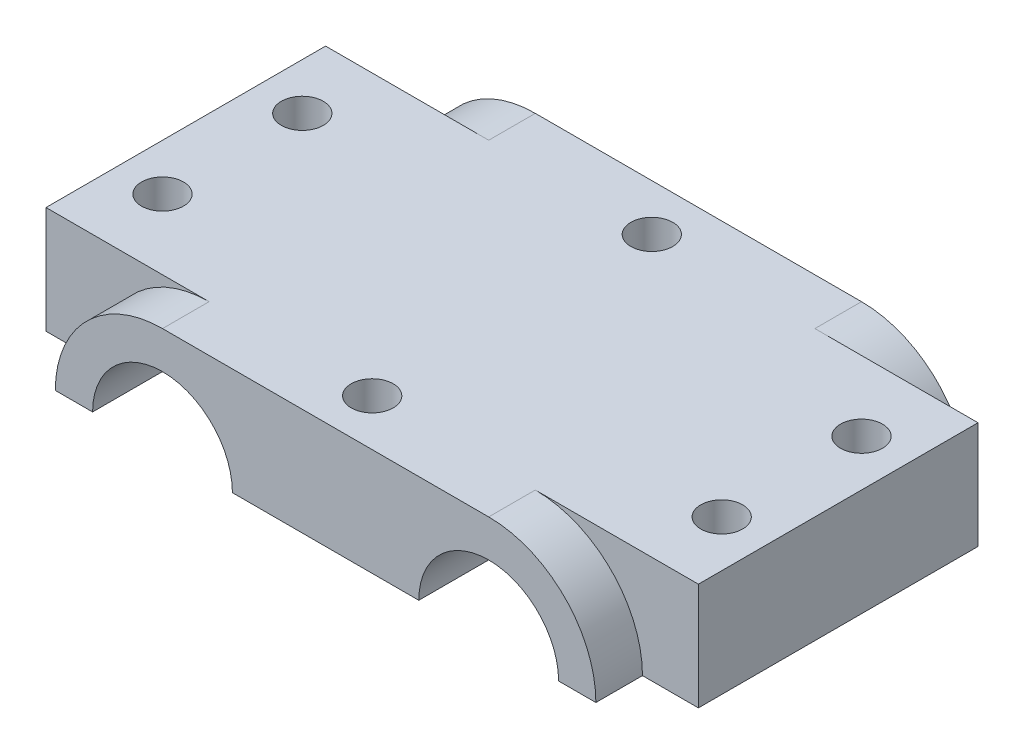
ISO-10303-21;
HEADER;
FILE_DESCRIPTION(('STEP AP214'),'2;1');
FILE_NAME('part.step','',(''),(''),'','','');
FILE_SCHEMA(('AUTOMOTIVE_DESIGN { 1 0 10303 214 1 1 1 1 }'));
ENDSEC;
DATA;
#1=APPLICATION_CONTEXT('core data for automotive mechanical design processes');
#2=APPLICATION_PROTOCOL_DEFINITION('international standard','automotive_design',2000,#1);
#3=PRODUCT_CONTEXT('',#1,'mechanical');
#4=PRODUCT('Part','Part','',(#3));
#5=PRODUCT_RELATED_PRODUCT_CATEGORY('part','',(#4));
#6=PRODUCT_DEFINITION_FORMATION('','',#4);
#7=PRODUCT_DEFINITION_CONTEXT('part definition',#1,'design');
#8=PRODUCT_DEFINITION('design','',#6,#7);
#9=PRODUCT_DEFINITION_SHAPE('','',#8);
#10=(LENGTH_UNIT() NAMED_UNIT(*) SI_UNIT(.MILLI.,.METRE.));
#11=(NAMED_UNIT(*) PLANE_ANGLE_UNIT() SI_UNIT($,.RADIAN.));
#12=(NAMED_UNIT(*) SI_UNIT($,.STERADIAN.) SOLID_ANGLE_UNIT());
#13=UNCERTAINTY_MEASURE_WITH_UNIT(LENGTH_MEASURE(1.E-05),#10,'distance_accuracy_value','');
#14=(GEOMETRIC_REPRESENTATION_CONTEXT(3) GLOBAL_UNCERTAINTY_ASSIGNED_CONTEXT((#13)) GLOBAL_UNIT_ASSIGNED_CONTEXT((#10,
#11,#12)) REPRESENTATION_CONTEXT('',''));
#15=CARTESIAN_POINT('',(0.,0.,0.));
#16=DIRECTION('',(0.,0.,1.));
#17=DIRECTION('',(1.,0.,0.));
#18=AXIS2_PLACEMENT_3D('',#15,#16,#17);
#19=CARTESIAN_POINT('',(35.,5.75000000000001,20.));
#20=DIRECTION('',(-1.,0.,0.));
#21=DIRECTION('',(0.,-1.,0.));
#22=AXIS2_PLACEMENT_3D('',#19,#20,#21);
#23=PLANE('',#22);
#24=DIRECTION('',(0.,1.,0.));
#25=VECTOR('',#24,1.);
#26=CARTESIAN_POINT('',(35.,-5.75,-15.));
#27=LINE('',#26,#25);
#28=CARTESIAN_POINT('',(35.,-5.75,-15.));
#29=VERTEX_POINT('',#28);
#30=CARTESIAN_POINT('',(35.,5.75000000000001,-15.));
#31=VERTEX_POINT('',#30);
#32=EDGE_CURVE('E173',#29,#31,#27,.T.);
#33=ORIENTED_EDGE('',*,*,#32,.T.);
#34=DIRECTION('',(0.,0.,-1.));
#35=VECTOR('',#34,1.);
#36=CARTESIAN_POINT('',(35.,5.75000000000001,20.));
#37=LINE('',#36,#35);
#38=CARTESIAN_POINT('',(35.,5.75000000000001,15.));
#39=VERTEX_POINT('',#38);
#40=EDGE_CURVE('E172',#39,#31,#37,.T.);
#41=ORIENTED_EDGE('',*,*,#40,.F.);
#42=DIRECTION('',(0.,1.,0.));
#43=VECTOR('',#42,1.);
#44=CARTESIAN_POINT('',(35.,-5.75,15.));
#45=LINE('',#44,#43);
#46=CARTESIAN_POINT('',(35.,-5.75,15.));
#47=VERTEX_POINT('',#46);
#48=EDGE_CURVE('E206',#47,#39,#45,.T.);
#49=ORIENTED_EDGE('',*,*,#48,.F.);
#50=DIRECTION('',(0.,0.,-1.));
#51=VECTOR('',#50,1.);
#52=CARTESIAN_POINT('',(35.,-5.75,20.));
#53=LINE('',#52,#51);
#54=EDGE_CURVE('E47',#47,#29,#53,.T.);
#55=ORIENTED_EDGE('',*,*,#54,.T.);
#56=EDGE_LOOP('',(#33,#41,#49,#55));
#57=FACE_BOUND('',#56,.T.);
#58=ADVANCED_FACE('F39',(#57),#23,.F.);
#59=CARTESIAN_POINT('',(35.,5.75000000000001,20.));
#60=DIRECTION('',(0.,-1.,0.));
#61=DIRECTION('',(1.,0.,0.));
#62=AXIS2_PLACEMENT_3D('',#59,#60,#61);
#63=PLANE('',#62);
#64=CARTESIAN_POINT('',(0.,5.75,-15.));
#65=DIRECTION('',(0.,1.,0.));
#66=DIRECTION('',(0.,0.,1.));
#67=AXIS2_PLACEMENT_3D('',#64,#65,#66);
#68=CIRCLE('',#67,2.25000000000001);
#69=CARTESIAN_POINT('',(0.,5.75,-12.75));
#70=VERTEX_POINT('',#69);
#71=EDGE_CURVE('E542',#70,#70,#68,.T.);
#72=ORIENTED_EDGE('',*,*,#71,.F.);
#73=EDGE_LOOP('',(#72));
#74=FACE_BOUND('',#73,.T.);
#75=CARTESIAN_POINT('',(0.,5.75,15.));
#76=DIRECTION('',(0.,1.,0.));
#77=DIRECTION('',(0.,0.,1.));
#78=AXIS2_PLACEMENT_3D('',#75,#76,#77);
#79=CIRCLE('',#78,2.25000000000001);
#80=CARTESIAN_POINT('',(0.,5.75,17.25));
#81=VERTEX_POINT('',#80);
#82=EDGE_CURVE('E358',#81,#81,#79,.T.);
#83=ORIENTED_EDGE('',*,*,#82,.F.);
#84=EDGE_LOOP('',(#83));
#85=FACE_BOUND('',#84,.T.);
#86=CARTESIAN_POINT('',(-30.,5.75000000000001,-7.5));
#87=DIRECTION('',(0.,1.,0.));
#88=DIRECTION('',(0.,0.,1.));
#89=AXIS2_PLACEMENT_3D('',#86,#87,#88);
#90=CIRCLE('',#89,2.25000000000001);
#91=CARTESIAN_POINT('',(-30.,5.75000000000001,-5.24999999999999));
#92=VERTEX_POINT('',#91);
#93=EDGE_CURVE('E357',#92,#92,#90,.T.);
#94=ORIENTED_EDGE('',*,*,#93,.F.);
#95=EDGE_LOOP('',(#94));
#96=FACE_BOUND('',#95,.T.);
#97=CARTESIAN_POINT('',(-30.,5.75000000000001,7.5));
#98=DIRECTION('',(0.,1.,0.));
#99=DIRECTION('',(0.,0.,1.));
#100=AXIS2_PLACEMENT_3D('',#97,#98,#99);
#101=CIRCLE('',#100,2.25000000000001);
#102=CARTESIAN_POINT('',(-30.,5.75000000000001,9.75000000000001));
#103=VERTEX_POINT('',#102);
#104=EDGE_CURVE('E368',#103,#103,#101,.T.);
#105=ORIENTED_EDGE('',*,*,#104,.F.);
#106=EDGE_LOOP('',(#105));
#107=FACE_BOUND('',#106,.T.);
#108=CARTESIAN_POINT('',(30.,5.75000000000001,-7.5));
#109=DIRECTION('',(0.,1.,0.));
#110=DIRECTION('',(0.,0.,1.));
#111=AXIS2_PLACEMENT_3D('',#108,#109,#110);
#112=CIRCLE('',#111,2.25000000000002);
#113=CARTESIAN_POINT('',(30.,5.75000000000001,-5.24999999999998));
#114=VERTEX_POINT('',#113);
#115=EDGE_CURVE('E374',#114,#114,#112,.T.);
#116=ORIENTED_EDGE('',*,*,#115,.F.);
#117=EDGE_LOOP('',(#116));
#118=FACE_BOUND('',#117,.T.);
#119=CARTESIAN_POINT('',(30.,5.75000000000001,7.5));
#120=DIRECTION('',(0.,1.,0.));
#121=DIRECTION('',(0.,0.,1.));
#122=AXIS2_PLACEMENT_3D('',#119,#120,#121);
#123=CIRCLE('',#122,2.25000000000002);
#124=CARTESIAN_POINT('',(30.,5.75000000000001,9.75000000000002));
#125=VERTEX_POINT('',#124);
#126=EDGE_CURVE('E380',#125,#125,#123,.T.);
#127=ORIENTED_EDGE('',*,*,#126,.F.);
#128=EDGE_LOOP('',(#127));
#129=FACE_BOUND('',#128,.T.);
#130=DIRECTION('',(-1.,0.,0.));
#131=VECTOR('',#130,1.);
#132=CARTESIAN_POINT('',(35.,5.75000000000001,-15.));
#133=LINE('',#132,#131);
#134=CARTESIAN_POINT('',(17.5,5.75000000000001,-15.));
#135=VERTEX_POINT('',#134);
#136=EDGE_CURVE('E164',#31,#135,#133,.T.);
#137=ORIENTED_EDGE('',*,*,#136,.T.);
#138=DIRECTION('',(0.,0.,-1.));
#139=VECTOR('',#138,1.);
#140=CARTESIAN_POINT('',(17.5,5.75000000000001,-15.));
#141=LINE('',#140,#139);
#142=CARTESIAN_POINT('',(17.5,5.75000000000001,-20.));
#143=VERTEX_POINT('',#142);
#144=EDGE_CURVE('E151',#135,#143,#141,.T.);
#145=ORIENTED_EDGE('',*,*,#144,.T.);
#146=DIRECTION('',(-1.,0.,0.));
#147=VECTOR('',#146,1.);
#148=CARTESIAN_POINT('',(35.,5.75000000000001,-20.));
#149=LINE('',#148,#147);
#150=CARTESIAN_POINT('',(-17.5,5.75,-20.));
#151=VERTEX_POINT('',#150);
#152=EDGE_CURVE('E264',#143,#151,#149,.T.);
#153=ORIENTED_EDGE('',*,*,#152,.T.);
#154=DIRECTION('',(0.,0.,-1.));
#155=VECTOR('',#154,1.);
#156=CARTESIAN_POINT('',(-17.5,5.75000000000001,-15.));
#157=LINE('',#156,#155);
#158=CARTESIAN_POINT('',(-17.5,5.75000000000001,-15.));
#159=VERTEX_POINT('',#158);
#160=EDGE_CURVE('E62',#159,#151,#157,.T.);
#161=ORIENTED_EDGE('',*,*,#160,.F.);
#162=DIRECTION('',(-1.,0.,0.));
#163=VECTOR('',#162,1.);
#164=CARTESIAN_POINT('',(-17.5,5.75000000000001,-15.));
#165=LINE('',#164,#163);
#166=CARTESIAN_POINT('',(-35.,5.75,-15.));
#167=VERTEX_POINT('',#166);
#168=EDGE_CURVE('E183',#159,#167,#165,.T.);
#169=ORIENTED_EDGE('',*,*,#168,.T.);
#170=DIRECTION('',(0.,0.,-1.));
#171=VECTOR('',#170,1.);
#172=CARTESIAN_POINT('',(-35.,5.75,20.));
#173=LINE('',#172,#171);
#174=CARTESIAN_POINT('',(-35.,5.75,15.));
#175=VERTEX_POINT('',#174);
#176=EDGE_CURVE('E261',#175,#167,#173,.T.);
#177=ORIENTED_EDGE('',*,*,#176,.F.);
#178=DIRECTION('',(-1.,0.,0.));
#179=VECTOR('',#178,1.);
#180=CARTESIAN_POINT('',(-17.5,5.75000000000001,15.));
#181=LINE('',#180,#179);
#182=CARTESIAN_POINT('',(-17.5,5.75000000000001,15.));
#183=VERTEX_POINT('',#182);
#184=EDGE_CURVE('E225',#183,#175,#181,.T.);
#185=ORIENTED_EDGE('',*,*,#184,.F.);
#186=DIRECTION('',(0.,0.,1.));
#187=VECTOR('',#186,1.);
#188=CARTESIAN_POINT('',(-17.5,5.75000000000001,15.));
#189=LINE('',#188,#187);
#190=CARTESIAN_POINT('',(-17.5,5.75000000000001,20.));
#191=VERTEX_POINT('',#190);
#192=EDGE_CURVE('E181',#183,#191,#189,.T.);
#193=ORIENTED_EDGE('',*,*,#192,.T.);
#194=DIRECTION('',(-1.,0.,0.));
#195=VECTOR('',#194,1.);
#196=CARTESIAN_POINT('',(35.,5.75000000000001,20.));
#197=LINE('',#196,#195);
#198=CARTESIAN_POINT('',(17.5,5.75,20.));
#199=VERTEX_POINT('',#198);
#200=EDGE_CURVE('E256',#199,#191,#197,.T.);
#201=ORIENTED_EDGE('',*,*,#200,.F.);
#202=DIRECTION('',(0.,0.,1.));
#203=VECTOR('',#202,1.);
#204=CARTESIAN_POINT('',(17.5,5.75000000000001,15.));
#205=LINE('',#204,#203);
#206=CARTESIAN_POINT('',(17.5,5.75000000000001,15.));
#207=VERTEX_POINT('',#206);
#208=EDGE_CURVE('E214',#207,#199,#205,.T.);
#209=ORIENTED_EDGE('',*,*,#208,.F.);
#210=DIRECTION('',(-1.,0.,0.));
#211=VECTOR('',#210,1.);
#212=CARTESIAN_POINT('',(35.,5.75000000000001,15.));
#213=LINE('',#212,#211);
#214=EDGE_CURVE('E208',#39,#207,#213,.T.);
#215=ORIENTED_EDGE('',*,*,#214,.F.);
#216=ORIENTED_EDGE('',*,*,#40,.T.);
#217=EDGE_LOOP('',(#137,#145,#153,#161,#169,#177,#185,#193,#201,#209,#215,#216));
#218=FACE_BOUND('',#217,.T.);
#219=ADVANCED_FACE('F169',(#74,#85,#96,#107,#118,#129,#218),#63,.F.);
#220=CARTESIAN_POINT('',(35.,-5.75,20.));
#221=DIRECTION('',(0.,1.,0.));
#222=DIRECTION('',(-1.,0.,0.));
#223=AXIS2_PLACEMENT_3D('',#220,#221,#222);
#224=PLANE('',#223);
#225=CARTESIAN_POINT('',(-30.,-5.75000000000001,-7.5));
#226=DIRECTION('',(0.,1.,0.));
#227=DIRECTION('',(0.,0.,1.));
#228=AXIS2_PLACEMENT_3D('',#225,#226,#227);
#229=CIRCLE('',#228,2.25000000000001);
#230=CARTESIAN_POINT('',(-30.,-5.75000000000001,-5.24999999999999));
#231=VERTEX_POINT('',#230);
#232=EDGE_CURVE('E361',#231,#231,#229,.T.);
#233=ORIENTED_EDGE('',*,*,#232,.T.);
#234=EDGE_LOOP('',(#233));
#235=FACE_BOUND('',#234,.T.);
#236=CARTESIAN_POINT('',(-30.,-5.75000000000001,7.5));
#237=DIRECTION('',(0.,1.,0.));
#238=DIRECTION('',(0.,0.,1.));
#239=AXIS2_PLACEMENT_3D('',#236,#237,#238);
#240=CIRCLE('',#239,2.25000000000001);
#241=CARTESIAN_POINT('',(-30.,-5.75000000000001,9.75000000000001));
#242=VERTEX_POINT('',#241);
#243=EDGE_CURVE('E371',#242,#242,#240,.T.);
#244=ORIENTED_EDGE('',*,*,#243,.T.);
#245=EDGE_LOOP('',(#244));
#246=FACE_BOUND('',#245,.T.);
#247=DIRECTION('',(0.,0.,-1.));
#248=VECTOR('',#247,1.);
#249=CARTESIAN_POINT('',(-29.,-5.75,-15.));
#250=LINE('',#249,#248);
#251=CARTESIAN_POINT('',(-29.,-5.75,-15.));
#252=VERTEX_POINT('',#251);
#253=CARTESIAN_POINT('',(-29.,-5.75,-20.));
#254=VERTEX_POINT('',#253);
#255=EDGE_CURVE('E180',#252,#254,#250,.T.);
#256=ORIENTED_EDGE('',*,*,#255,.T.);
#257=DIRECTION('',(1.,0.,0.));
#258=VECTOR('',#257,1.);
#259=CARTESIAN_POINT('',(35.,-5.75,-20.));
#260=LINE('',#259,#258);
#261=CARTESIAN_POINT('',(-25.,-5.75,-20.));
#262=VERTEX_POINT('',#261);
#263=EDGE_CURVE('E262',#254,#262,#260,.T.);
#264=ORIENTED_EDGE('',*,*,#263,.T.);
#265=DIRECTION('',(0.,0.,1.));
#266=VECTOR('',#265,1.);
#267=CARTESIAN_POINT('',(-25.,-5.75000000000001,-20.001));
#268=LINE('',#267,#266);
#269=CARTESIAN_POINT('',(-25.,-5.75000000000001,20.));
#270=VERTEX_POINT('',#269);
#271=EDGE_CURVE('E245',#262,#270,#268,.T.);
#272=ORIENTED_EDGE('',*,*,#271,.T.);
#273=DIRECTION('',(1.,0.,0.));
#274=VECTOR('',#273,1.);
#275=CARTESIAN_POINT('',(35.,-5.75,20.));
#276=LINE('',#275,#274);
#277=CARTESIAN_POINT('',(-29.,-5.75,20.));
#278=VERTEX_POINT('',#277);
#279=EDGE_CURVE('E254',#278,#270,#276,.T.);
#280=ORIENTED_EDGE('',*,*,#279,.F.);
#281=DIRECTION('',(0.,0.,1.));
#282=VECTOR('',#281,1.);
#283=CARTESIAN_POINT('',(-29.,-5.75,15.));
#284=LINE('',#283,#282);
#285=CARTESIAN_POINT('',(-29.,-5.75,15.));
#286=VERTEX_POINT('',#285);
#287=EDGE_CURVE('E219',#286,#278,#284,.T.);
#288=ORIENTED_EDGE('',*,*,#287,.F.);
#289=DIRECTION('',(1.,0.,0.));
#290=VECTOR('',#289,1.);
#291=CARTESIAN_POINT('',(-35.,-5.75000000000001,15.));
#292=LINE('',#291,#290);
#293=CARTESIAN_POINT('',(-35.,-5.75000000000001,15.));
#294=VERTEX_POINT('',#293);
#295=EDGE_CURVE('E228',#294,#286,#292,.T.);
#296=ORIENTED_EDGE('',*,*,#295,.F.);
#297=DIRECTION('',(0.,0.,-1.));
#298=VECTOR('',#297,1.);
#299=CARTESIAN_POINT('',(-35.,-5.75000000000001,20.));
#300=LINE('',#299,#298);
#301=CARTESIAN_POINT('',(-35.,-5.75000000000001,-15.));
#302=VERTEX_POINT('',#301);
#303=EDGE_CURVE('E11',#294,#302,#300,.T.);
#304=ORIENTED_EDGE('',*,*,#303,.T.);
#305=DIRECTION('',(1.,0.,0.));
#306=VECTOR('',#305,1.);
#307=CARTESIAN_POINT('',(-35.,-5.75000000000001,-15.));
#308=LINE('',#307,#306);
#309=EDGE_CURVE('E189',#302,#252,#308,.T.);
#310=ORIENTED_EDGE('',*,*,#309,.T.);
#311=EDGE_LOOP('',(#256,#264,#272,#280,#288,#296,#304,#310));
#312=FACE_BOUND('',#311,.T.);
#313=ADVANCED_FACE('F309',(#235,#246,#312),#224,.F.);
#314=CARTESIAN_POINT('',(30.,-5.75000000000001,-7.5));
#315=DIRECTION('',(0.,1.,0.));
#316=DIRECTION('',(0.,0.,1.));
#317=AXIS2_PLACEMENT_3D('',#314,#315,#316);
#318=CIRCLE('',#317,2.25000000000002);
#319=CARTESIAN_POINT('',(30.,-5.75000000000001,-5.24999999999998));
#320=VERTEX_POINT('',#319);
#321=EDGE_CURVE('E377',#320,#320,#318,.T.);
#322=ORIENTED_EDGE('',*,*,#321,.T.);
#323=EDGE_LOOP('',(#322));
#324=FACE_BOUND('',#323,.T.);
#325=CARTESIAN_POINT('',(30.,-5.75000000000001,7.5));
#326=DIRECTION('',(0.,1.,0.));
#327=DIRECTION('',(0.,0.,1.));
#328=AXIS2_PLACEMENT_3D('',#325,#326,#327);
#329=CIRCLE('',#328,2.25000000000002);
#330=CARTESIAN_POINT('',(30.,-5.75000000000001,9.75000000000002));
#331=VERTEX_POINT('',#330);
#332=EDGE_CURVE('E196',#331,#331,#329,.T.);
#333=ORIENTED_EDGE('',*,*,#332,.T.);
#334=EDGE_LOOP('',(#333));
#335=FACE_BOUND('',#334,.T.);
#336=DIRECTION('',(0.,0.,-1.));
#337=VECTOR('',#336,1.);
#338=CARTESIAN_POINT('',(29.,-5.75,-15.));
#339=LINE('',#338,#337);
#340=CARTESIAN_POINT('',(29.,-5.75,-15.));
#341=VERTEX_POINT('',#340);
#342=CARTESIAN_POINT('',(29.,-5.75,-20.));
#343=VERTEX_POINT('',#342);
#344=EDGE_CURVE('E54',#341,#343,#339,.T.);
#345=ORIENTED_EDGE('',*,*,#344,.F.);
#346=DIRECTION('',(1.,0.,0.));
#347=VECTOR('',#346,1.);
#348=CARTESIAN_POINT('',(29.,-5.75,-15.));
#349=LINE('',#348,#347);
#350=EDGE_CURVE('E160',#341,#29,#349,.T.);
#351=ORIENTED_EDGE('',*,*,#350,.T.);
#352=ORIENTED_EDGE('',*,*,#54,.F.);
#353=DIRECTION('',(1.,0.,0.));
#354=VECTOR('',#353,1.);
#355=CARTESIAN_POINT('',(29.,-5.75,15.));
#356=LINE('',#355,#354);
#357=CARTESIAN_POINT('',(29.,-5.75,15.));
#358=VERTEX_POINT('',#357);
#359=EDGE_CURVE('E203',#358,#47,#356,.T.);
#360=ORIENTED_EDGE('',*,*,#359,.F.);
#361=DIRECTION('',(0.,0.,1.));
#362=VECTOR('',#361,1.);
#363=CARTESIAN_POINT('',(29.,-5.75,15.));
#364=LINE('',#363,#362);
#365=CARTESIAN_POINT('',(29.,-5.75,20.));
#366=VERTEX_POINT('',#365);
#367=EDGE_CURVE('E211',#358,#366,#364,.T.);
#368=ORIENTED_EDGE('',*,*,#367,.T.);
#369=CARTESIAN_POINT('',(25.,-5.75000000000001,20.));
#370=VERTEX_POINT('',#369);
#371=EDGE_CURVE('E258',#370,#366,#276,.T.);
#372=ORIENTED_EDGE('',*,*,#371,.F.);
#373=DIRECTION('',(0.,0.,1.));
#374=VECTOR('',#373,1.);
#375=CARTESIAN_POINT('',(25.,-5.75000000000001,-20.001));
#376=LINE('',#375,#374);
#377=CARTESIAN_POINT('',(25.,-5.75000000000001,-20.));
#378=VERTEX_POINT('',#377);
#379=EDGE_CURVE('E240',#378,#370,#376,.T.);
#380=ORIENTED_EDGE('',*,*,#379,.F.);
#381=EDGE_CURVE('E242',#378,#343,#260,.T.);
#382=ORIENTED_EDGE('',*,*,#381,.T.);
#383=EDGE_LOOP('',(#345,#351,#352,#360,#368,#372,#380,#382));
#384=FACE_BOUND('',#383,.T.);
#385=ADVANCED_FACE('F275',(#324,#335,#384),#224,.F.);
#386=CARTESIAN_POINT('',(0.,0.,-20.));
#387=DIRECTION('',(0.,0.,-1.));
#388=DIRECTION('',(-1.,0.,0.));
#389=AXIS2_PLACEMENT_3D('',#386,#387,#388);
#390=PLANE('',#389);
#391=ORIENTED_EDGE('',*,*,#152,.F.);
#392=CARTESIAN_POINT('',(17.5,-5.75000000000001,-20.));
#393=DIRECTION('',(0.,0.,-1.));
#394=DIRECTION('',(1.,0.,0.));
#395=AXIS2_PLACEMENT_3D('',#392,#393,#394);
#396=CIRCLE('',#395,11.5);
#397=EDGE_CURVE('E155',#143,#343,#396,.T.);
#398=ORIENTED_EDGE('',*,*,#397,.T.);
#399=ORIENTED_EDGE('',*,*,#381,.F.);
#400=CARTESIAN_POINT('',(17.5,-5.75000000000001,-20.));
#401=DIRECTION('',(0.,0.,-1.));
#402=DIRECTION('',(-1.,0.,0.));
#403=AXIS2_PLACEMENT_3D('',#400,#401,#402);
#404=CIRCLE('',#403,7.5);
#405=CARTESIAN_POINT('',(10.,-5.75,-20.));
#406=VERTEX_POINT('',#405);
#407=EDGE_CURVE('E233',#378,#406,#404,.F.);
#408=ORIENTED_EDGE('',*,*,#407,.T.);
#409=CARTESIAN_POINT('',(-10.,-5.75000000000001,-20.));
#410=VERTEX_POINT('',#409);
#411=EDGE_CURVE('E265',#410,#406,#260,.T.);
#412=ORIENTED_EDGE('',*,*,#411,.F.);
#413=CARTESIAN_POINT('',(-17.5,-5.75000000000001,-20.));
#414=DIRECTION('',(0.,0.,-1.));
#415=DIRECTION('',(-1.,0.,0.));
#416=AXIS2_PLACEMENT_3D('',#413,#414,#415);
#417=CIRCLE('',#416,7.5);
#418=EDGE_CURVE('E237',#410,#262,#417,.F.);
#419=ORIENTED_EDGE('',*,*,#418,.T.);
#420=ORIENTED_EDGE('',*,*,#263,.F.);
#421=CARTESIAN_POINT('',(-17.5,-5.75000000000001,-20.));
#422=DIRECTION('',(0.,0.,-1.));
#423=DIRECTION('',(-1.,0.,0.));
#424=AXIS2_PLACEMENT_3D('',#421,#422,#423);
#425=CIRCLE('',#424,11.5);
#426=EDGE_CURVE('E187',#254,#151,#425,.T.);
#427=ORIENTED_EDGE('',*,*,#426,.T.);
#428=EDGE_LOOP('',(#391,#398,#399,#408,#412,#419,#420,#427));
#429=FACE_BOUND('',#428,.T.);
#430=ADVANCED_FACE('F288',(#429),#390,.T.);
#431=CARTESIAN_POINT('',(0.,-5.75000000000001,-15.));
#432=DIRECTION('',(0.,1.,0.));
#433=DIRECTION('',(0.,0.,1.));
#434=AXIS2_PLACEMENT_3D('',#431,#432,#433);
#435=CIRCLE('',#434,2.25000000000001);
#436=CARTESIAN_POINT('',(0.,-5.75000000000001,-12.75));
#437=VERTEX_POINT('',#436);
#438=EDGE_CURVE('E352',#437,#437,#435,.T.);
#439=ORIENTED_EDGE('',*,*,#438,.T.);
#440=EDGE_LOOP('',(#439));
#441=FACE_BOUND('',#440,.T.);
#442=CARTESIAN_POINT('',(0.,-5.75000000000001,15.));
#443=DIRECTION('',(0.,1.,0.));
#444=DIRECTION('',(0.,0.,1.));
#445=AXIS2_PLACEMENT_3D('',#442,#443,#444);
#446=CIRCLE('',#445,2.25000000000001);
#447=CARTESIAN_POINT('',(0.,-5.75000000000001,17.25));
#448=VERTEX_POINT('',#447);
#449=EDGE_CURVE('E355',#448,#448,#446,.T.);
#450=ORIENTED_EDGE('',*,*,#449,.T.);
#451=EDGE_LOOP('',(#450));
#452=FACE_BOUND('',#451,.T.);
#453=ORIENTED_EDGE('',*,*,#411,.T.);
#454=DIRECTION('',(0.,0.,1.));
#455=VECTOR('',#454,1.);
#456=CARTESIAN_POINT('',(10.,-5.75000000000001,-20.001));
#457=LINE('',#456,#455);
#458=CARTESIAN_POINT('',(10.,-5.75000000000001,20.));
#459=VERTEX_POINT('',#458);
#460=EDGE_CURVE('E239',#406,#459,#457,.T.);
#461=ORIENTED_EDGE('',*,*,#460,.T.);
#462=CARTESIAN_POINT('',(-10.,-5.75000000000001,20.));
#463=VERTEX_POINT('',#462);
#464=EDGE_CURVE('E257',#463,#459,#276,.T.);
#465=ORIENTED_EDGE('',*,*,#464,.F.);
#466=DIRECTION('',(0.,0.,1.));
#467=VECTOR('',#466,1.);
#468=CARTESIAN_POINT('',(-10.,-5.75000000000001,-20.001));
#469=LINE('',#468,#467);
#470=EDGE_CURVE('E216',#410,#463,#469,.T.);
#471=ORIENTED_EDGE('',*,*,#470,.F.);
#472=EDGE_LOOP('',(#453,#461,#465,#471));
#473=FACE_BOUND('',#472,.T.);
#474=ADVANCED_FACE('F285',(#441,#452,#473),#224,.F.);
#475=CARTESIAN_POINT('',(-35.,5.75,20.));
#476=DIRECTION('',(1.,0.,0.));
#477=DIRECTION('',(0.,1.,0.));
#478=AXIS2_PLACEMENT_3D('',#475,#476,#477);
#479=PLANE('',#478);
#480=ORIENTED_EDGE('',*,*,#176,.T.);
#481=DIRECTION('',(0.,-1.,0.));
#482=VECTOR('',#481,1.);
#483=CARTESIAN_POINT('',(-35.,5.75,-15.));
#484=LINE('',#483,#482);
#485=EDGE_CURVE('E192',#167,#302,#484,.T.);
#486=ORIENTED_EDGE('',*,*,#485,.T.);
#487=ORIENTED_EDGE('',*,*,#303,.F.);
#488=DIRECTION('',(0.,-1.,0.));
#489=VECTOR('',#488,1.);
#490=CARTESIAN_POINT('',(-35.,5.75,15.));
#491=LINE('',#490,#489);
#492=EDGE_CURVE('E230',#175,#294,#491,.T.);
#493=ORIENTED_EDGE('',*,*,#492,.F.);
#494=EDGE_LOOP('',(#480,#486,#487,#493));
#495=FACE_BOUND('',#494,.T.);
#496=ADVANCED_FACE('F41',(#495),#479,.F.);
#497=CARTESIAN_POINT('',(0.,0.,20.));
#498=DIRECTION('',(0.,0.,-1.));
#499=DIRECTION('',(-1.,0.,0.));
#500=AXIS2_PLACEMENT_3D('',#497,#498,#499);
#501=PLANE('',#500);
#502=ORIENTED_EDGE('',*,*,#371,.T.);
#503=CARTESIAN_POINT('',(17.5,-5.75000000000001,20.));
#504=DIRECTION('',(0.,0.,-1.));
#505=DIRECTION('',(1.,0.,0.));
#506=AXIS2_PLACEMENT_3D('',#503,#504,#505);
#507=CIRCLE('',#506,11.5);
#508=EDGE_CURVE('E204',#199,#366,#507,.T.);
#509=ORIENTED_EDGE('',*,*,#508,.F.);
#510=ORIENTED_EDGE('',*,*,#200,.T.);
#511=CARTESIAN_POINT('',(-17.5,-5.75000000000001,20.));
#512=DIRECTION('',(0.,0.,-1.));
#513=DIRECTION('',(-1.,0.,0.));
#514=AXIS2_PLACEMENT_3D('',#511,#512,#513);
#515=CIRCLE('',#514,11.5);
#516=EDGE_CURVE('E213',#278,#191,#515,.T.);
#517=ORIENTED_EDGE('',*,*,#516,.F.);
#518=ORIENTED_EDGE('',*,*,#279,.T.);
#519=CARTESIAN_POINT('',(-17.5,-5.75000000000001,20.));
#520=DIRECTION('',(0.,0.,1.));
#521=DIRECTION('',(1.,0.,0.));
#522=AXIS2_PLACEMENT_3D('',#519,#520,#521);
#523=CIRCLE('',#522,7.5);
#524=EDGE_CURVE('E248',#463,#270,#523,.T.);
#525=ORIENTED_EDGE('',*,*,#524,.F.);
#526=ORIENTED_EDGE('',*,*,#464,.T.);
#527=CARTESIAN_POINT('',(17.5,-5.75000000000001,20.));
#528=DIRECTION('',(0.,0.,1.));
#529=DIRECTION('',(-1.,0.,0.));
#530=AXIS2_PLACEMENT_3D('',#527,#528,#529);
#531=CIRCLE('',#530,7.5);
#532=EDGE_CURVE('E236',#370,#459,#531,.T.);
#533=ORIENTED_EDGE('',*,*,#532,.F.);
#534=EDGE_LOOP('',(#502,#509,#510,#517,#518,#525,#526,#533));
#535=FACE_BOUND('',#534,.T.);
#536=ADVANCED_FACE('F295',(#535),#501,.F.);
#537=CARTESIAN_POINT('',(-17.5,-5.75000000000001,-20.001));
#538=DIRECTION('',(0.,0.,1.));
#539=DIRECTION('',(1.,0.,0.));
#540=AXIS2_PLACEMENT_3D('',#537,#538,#539);
#541=CYLINDRICAL_SURFACE('',#540,7.5);
#542=ORIENTED_EDGE('',*,*,#470,.T.);
#543=ORIENTED_EDGE('',*,*,#524,.T.);
#544=ORIENTED_EDGE('',*,*,#271,.F.);
#545=ORIENTED_EDGE('',*,*,#418,.F.);
#546=EDGE_LOOP('',(#542,#543,#544,#545));
#547=FACE_BOUND('',#546,.T.);
#548=ADVANCED_FACE('F313',(#547),#541,.F.);
#549=CARTESIAN_POINT('',(17.5,-5.75000000000001,-20.001));
#550=DIRECTION('',(0.,0.,1.));
#551=DIRECTION('',(1.,0.,0.));
#552=AXIS2_PLACEMENT_3D('',#549,#550,#551);
#553=CYLINDRICAL_SURFACE('',#552,7.5);
#554=ORIENTED_EDGE('',*,*,#379,.T.);
#555=ORIENTED_EDGE('',*,*,#532,.T.);
#556=ORIENTED_EDGE('',*,*,#460,.F.);
#557=ORIENTED_EDGE('',*,*,#407,.F.);
#558=EDGE_LOOP('',(#554,#555,#556,#557));
#559=FACE_BOUND('',#558,.T.);
#560=ADVANCED_FACE('F291',(#559),#553,.F.);
#561=CARTESIAN_POINT('',(-17.5,-5.75000000000001,15.));
#562=DIRECTION('',(0.,0.,1.));
#563=DIRECTION('',(1.,0.,0.));
#564=AXIS2_PLACEMENT_3D('',#561,#562,#563);
#565=CYLINDRICAL_SURFACE('',#564,11.5);
#566=ORIENTED_EDGE('',*,*,#516,.T.);
#567=ORIENTED_EDGE('',*,*,#192,.F.);
#568=CARTESIAN_POINT('',(-17.5,-5.75000000000001,15.));
#569=DIRECTION('',(0.,0.,-1.));
#570=DIRECTION('',(-1.,0.,0.));
#571=AXIS2_PLACEMENT_3D('',#568,#569,#570);
#572=CIRCLE('',#571,11.5);
#573=EDGE_CURVE('E221',#286,#183,#572,.T.);
#574=ORIENTED_EDGE('',*,*,#573,.F.);
#575=ORIENTED_EDGE('',*,*,#287,.T.);
#576=EDGE_LOOP('',(#566,#567,#574,#575));
#577=FACE_BOUND('',#576,.T.);
#578=ADVANCED_FACE('F319',(#577),#565,.T.);
#579=CARTESIAN_POINT('',(-17.5,-5.75000000000001,15.));
#580=DIRECTION('',(0.,0.,-1.));
#581=DIRECTION('',(-1.,0.,0.));
#582=AXIS2_PLACEMENT_3D('',#579,#580,#581);
#583=PLANE('',#582);
#584=ORIENTED_EDGE('',*,*,#184,.T.);
#585=ORIENTED_EDGE('',*,*,#492,.T.);
#586=ORIENTED_EDGE('',*,*,#295,.T.);
#587=ORIENTED_EDGE('',*,*,#573,.T.);
#588=EDGE_LOOP('',(#584,#585,#586,#587));
#589=FACE_BOUND('',#588,.T.);
#590=ADVANCED_FACE('F414',(#589),#583,.F.);
#591=CARTESIAN_POINT('',(17.5,-5.75000000000001,15.));
#592=DIRECTION('',(0.,0.,1.));
#593=DIRECTION('',(1.,0.,0.));
#594=AXIS2_PLACEMENT_3D('',#591,#592,#593);
#595=CYLINDRICAL_SURFACE('',#594,11.5);
#596=ORIENTED_EDGE('',*,*,#508,.T.);
#597=ORIENTED_EDGE('',*,*,#367,.F.);
#598=CARTESIAN_POINT('',(17.5,-5.75000000000001,15.));
#599=DIRECTION('',(0.,0.,-1.));
#600=DIRECTION('',(1.,0.,0.));
#601=AXIS2_PLACEMENT_3D('',#598,#599,#600);
#602=CIRCLE('',#601,11.5);
#603=EDGE_CURVE('E200',#207,#358,#602,.T.);
#604=ORIENTED_EDGE('',*,*,#603,.F.);
#605=ORIENTED_EDGE('',*,*,#208,.T.);
#606=EDGE_LOOP('',(#596,#597,#604,#605));
#607=FACE_BOUND('',#606,.T.);
#608=ADVANCED_FACE('F299',(#607),#595,.T.);
#609=CARTESIAN_POINT('',(17.5,-5.75000000000001,15.));
#610=DIRECTION('',(0.,0.,1.));
#611=DIRECTION('',(1.,0.,0.));
#612=AXIS2_PLACEMENT_3D('',#609,#610,#611);
#613=PLANE('',#612);
#614=ORIENTED_EDGE('',*,*,#603,.T.);
#615=ORIENTED_EDGE('',*,*,#359,.T.);
#616=ORIENTED_EDGE('',*,*,#48,.T.);
#617=ORIENTED_EDGE('',*,*,#214,.T.);
#618=EDGE_LOOP('',(#614,#615,#616,#617));
#619=FACE_BOUND('',#618,.T.);
#620=ADVANCED_FACE('F301',(#619),#613,.T.);
#621=CARTESIAN_POINT('',(-17.5,-5.75000000000001,-15.));
#622=DIRECTION('',(0.,0.,-1.));
#623=DIRECTION('',(-1.,0.,0.));
#624=AXIS2_PLACEMENT_3D('',#621,#622,#623);
#625=CYLINDRICAL_SURFACE('',#624,11.5);
#626=ORIENTED_EDGE('',*,*,#426,.F.);
#627=ORIENTED_EDGE('',*,*,#255,.F.);
#628=CARTESIAN_POINT('',(-17.5,-5.75000000000001,-15.));
#629=DIRECTION('',(0.,0.,-1.));
#630=DIRECTION('',(-1.,0.,0.));
#631=AXIS2_PLACEMENT_3D('',#628,#629,#630);
#632=CIRCLE('',#631,11.5);
#633=EDGE_CURVE('E186',#252,#159,#632,.T.);
#634=ORIENTED_EDGE('',*,*,#633,.T.);
#635=ORIENTED_EDGE('',*,*,#160,.T.);
#636=EDGE_LOOP('',(#626,#627,#634,#635));
#637=FACE_BOUND('',#636,.T.);
#638=ADVANCED_FACE('F407',(#637),#625,.T.);
#639=CARTESIAN_POINT('',(-17.5,-5.75000000000001,-15.));
#640=DIRECTION('',(0.,0.,1.));
#641=DIRECTION('',(-1.,0.,0.));
#642=AXIS2_PLACEMENT_3D('',#639,#640,#641);
#643=PLANE('',#642);
#644=ORIENTED_EDGE('',*,*,#168,.F.);
#645=ORIENTED_EDGE('',*,*,#633,.F.);
#646=ORIENTED_EDGE('',*,*,#309,.F.);
#647=ORIENTED_EDGE('',*,*,#485,.F.);
#648=EDGE_LOOP('',(#644,#645,#646,#647));
#649=FACE_BOUND('',#648,.T.);
#650=ADVANCED_FACE('F404',(#649),#643,.F.);
#651=CARTESIAN_POINT('',(17.5,-5.75000000000001,-15.));
#652=DIRECTION('',(0.,0.,-1.));
#653=DIRECTION('',(-1.,0.,0.));
#654=AXIS2_PLACEMENT_3D('',#651,#652,#653);
#655=CYLINDRICAL_SURFACE('',#654,11.5);
#656=ORIENTED_EDGE('',*,*,#397,.F.);
#657=ORIENTED_EDGE('',*,*,#144,.F.);
#658=CARTESIAN_POINT('',(17.5,-5.75000000000001,-15.));
#659=DIRECTION('',(0.,0.,-1.));
#660=DIRECTION('',(1.,0.,0.));
#661=AXIS2_PLACEMENT_3D('',#658,#659,#660);
#662=CIRCLE('',#661,11.5);
#663=EDGE_CURVE('E154',#135,#341,#662,.T.);
#664=ORIENTED_EDGE('',*,*,#663,.T.);
#665=ORIENTED_EDGE('',*,*,#344,.T.);
#666=EDGE_LOOP('',(#656,#657,#664,#665));
#667=FACE_BOUND('',#666,.T.);
#668=ADVANCED_FACE('F153',(#667),#655,.T.);
#669=CARTESIAN_POINT('',(17.5,-5.75000000000001,-15.));
#670=DIRECTION('',(0.,0.,-1.));
#671=DIRECTION('',(1.,0.,0.));
#672=AXIS2_PLACEMENT_3D('',#669,#670,#671);
#673=PLANE('',#672);
#674=ORIENTED_EDGE('',*,*,#663,.F.);
#675=ORIENTED_EDGE('',*,*,#136,.F.);
#676=ORIENTED_EDGE('',*,*,#32,.F.);
#677=ORIENTED_EDGE('',*,*,#350,.F.);
#678=EDGE_LOOP('',(#674,#675,#676,#677));
#679=FACE_BOUND('',#678,.T.);
#680=ADVANCED_FACE('F163',(#679),#673,.T.);
#681=CARTESIAN_POINT('',(30.,5.75,7.5));
#682=DIRECTION('',(0.,1.,0.));
#683=DIRECTION('',(0.,0.,1.));
#684=AXIS2_PLACEMENT_3D('',#681,#682,#683);
#685=CYLINDRICAL_SURFACE('',#684,2.25000000000002);
#686=ORIENTED_EDGE('',*,*,#332,.F.);
#687=EDGE_LOOP('',(#686));
#688=FACE_BOUND('',#687,.T.);
#689=ORIENTED_EDGE('',*,*,#126,.T.);
#690=EDGE_LOOP('',(#689));
#691=FACE_BOUND('',#690,.T.);
#692=ADVANCED_FACE('F386',(#688,#691),#685,.F.);
#693=CARTESIAN_POINT('',(30.,5.75,-7.5));
#694=DIRECTION('',(0.,1.,0.));
#695=DIRECTION('',(0.,0.,1.));
#696=AXIS2_PLACEMENT_3D('',#693,#694,#695);
#697=CYLINDRICAL_SURFACE('',#696,2.25000000000002);
#698=ORIENTED_EDGE('',*,*,#321,.F.);
#699=EDGE_LOOP('',(#698));
#700=FACE_BOUND('',#699,.T.);
#701=ORIENTED_EDGE('',*,*,#115,.T.);
#702=EDGE_LOOP('',(#701));
#703=FACE_BOUND('',#702,.T.);
#704=ADVANCED_FACE('F388',(#700,#703),#697,.F.);
#705=CARTESIAN_POINT('',(-30.,5.75000000000001,7.5));
#706=DIRECTION('',(0.,1.,0.));
#707=DIRECTION('',(0.,0.,1.));
#708=AXIS2_PLACEMENT_3D('',#705,#706,#707);
#709=CYLINDRICAL_SURFACE('',#708,2.25000000000001);
#710=ORIENTED_EDGE('',*,*,#243,.F.);
#711=EDGE_LOOP('',(#710));
#712=FACE_BOUND('',#711,.T.);
#713=ORIENTED_EDGE('',*,*,#104,.T.);
#714=EDGE_LOOP('',(#713));
#715=FACE_BOUND('',#714,.T.);
#716=ADVANCED_FACE('F396',(#712,#715),#709,.F.);
#717=CARTESIAN_POINT('',(-30.,5.75000000000001,-7.5));
#718=DIRECTION('',(0.,1.,0.));
#719=DIRECTION('',(0.,0.,1.));
#720=AXIS2_PLACEMENT_3D('',#717,#718,#719);
#721=CYLINDRICAL_SURFACE('',#720,2.25000000000001);
#722=ORIENTED_EDGE('',*,*,#232,.F.);
#723=EDGE_LOOP('',(#722));
#724=FACE_BOUND('',#723,.T.);
#725=ORIENTED_EDGE('',*,*,#93,.T.);
#726=EDGE_LOOP('',(#725));
#727=FACE_BOUND('',#726,.T.);
#728=ADVANCED_FACE('F510',(#724,#727),#721,.F.);
#729=CARTESIAN_POINT('',(0.,5.75,15.));
#730=DIRECTION('',(0.,1.,0.));
#731=DIRECTION('',(0.,0.,1.));
#732=AXIS2_PLACEMENT_3D('',#729,#730,#731);
#733=CYLINDRICAL_SURFACE('',#732,2.25000000000001);
#734=ORIENTED_EDGE('',*,*,#449,.F.);
#735=EDGE_LOOP('',(#734));
#736=FACE_BOUND('',#735,.T.);
#737=ORIENTED_EDGE('',*,*,#82,.T.);
#738=EDGE_LOOP('',(#737));
#739=FACE_BOUND('',#738,.T.);
#740=ADVANCED_FACE('F519',(#736,#739),#733,.F.);
#741=CARTESIAN_POINT('',(0.,5.75,-15.));
#742=DIRECTION('',(0.,1.,0.));
#743=DIRECTION('',(0.,0.,1.));
#744=AXIS2_PLACEMENT_3D('',#741,#742,#743);
#745=CYLINDRICAL_SURFACE('',#744,2.25000000000001);
#746=ORIENTED_EDGE('',*,*,#438,.F.);
#747=EDGE_LOOP('',(#746));
#748=FACE_BOUND('',#747,.T.);
#749=ORIENTED_EDGE('',*,*,#71,.T.);
#750=EDGE_LOOP('',(#749));
#751=FACE_BOUND('',#750,.T.);
#752=ADVANCED_FACE('F528',(#748,#751),#745,.F.);
#753=CLOSED_SHELL('',(#58,#219,#313,#385,#430,#474,#496,#536,#548,#560,#578,#590,#608,#620,#638,
#650,#668,#680,#692,#704,#716,#728,#740,#752));
#754=MANIFOLD_SOLID_BREP('B2',#753);
#755=ADVANCED_BREP_SHAPE_REPRESENTATION('',(#18,#754),#14);
#756=SHAPE_DEFINITION_REPRESENTATION(#9,#755);
ENDSEC;
END-ISO-10303-21;
